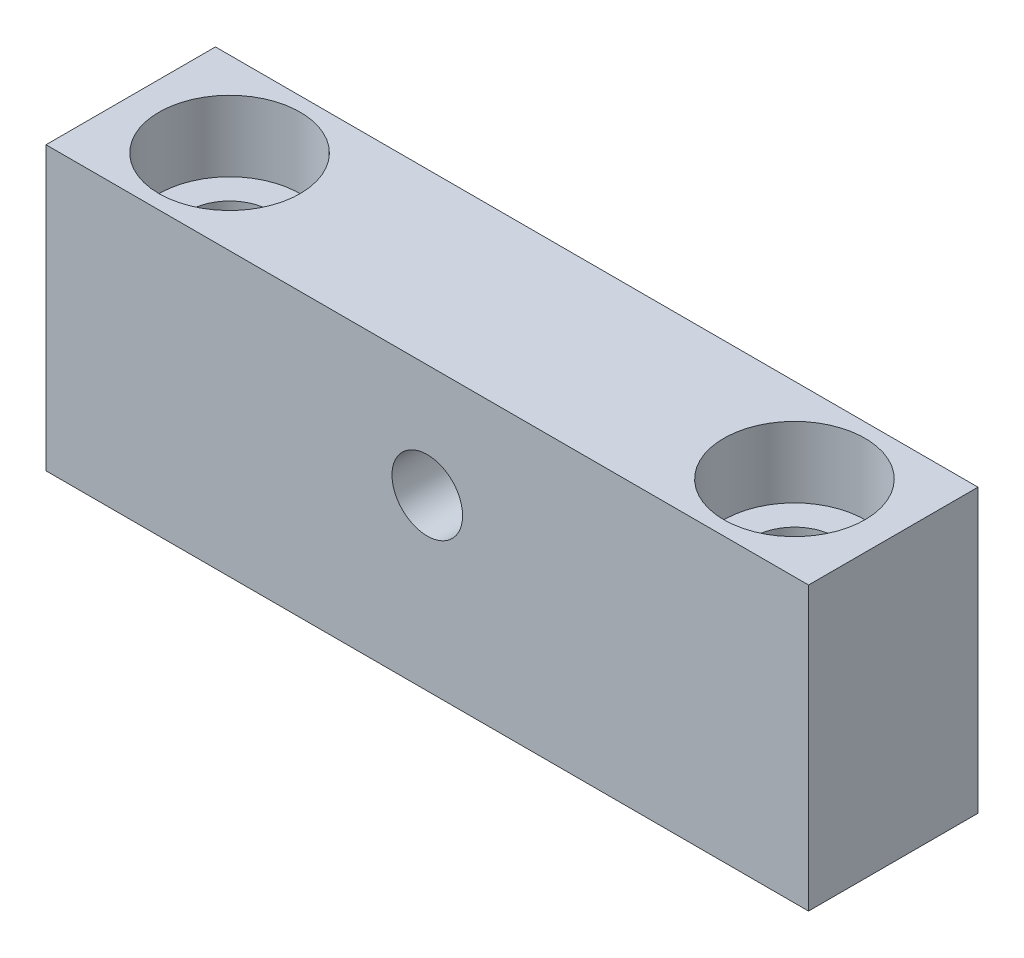
ISO-10303-21;
HEADER;
FILE_DESCRIPTION(('STEP AP214'),'2;1');
FILE_NAME('part.step','',(''),(''),'','','');
FILE_SCHEMA(('AUTOMOTIVE_DESIGN { 1 0 10303 214 1 1 1 1 }'));
ENDSEC;
DATA;
#1=APPLICATION_CONTEXT('core data for automotive mechanical design processes');
#2=APPLICATION_PROTOCOL_DEFINITION('international standard','automotive_design',2000,#1);
#3=PRODUCT_CONTEXT('',#1,'mechanical');
#4=PRODUCT('Part','Part','',(#3));
#5=PRODUCT_RELATED_PRODUCT_CATEGORY('part','',(#4));
#6=PRODUCT_DEFINITION_FORMATION('','',#4);
#7=PRODUCT_DEFINITION_CONTEXT('part definition',#1,'design');
#8=PRODUCT_DEFINITION('design','',#6,#7);
#9=PRODUCT_DEFINITION_SHAPE('','',#8);
#10=(LENGTH_UNIT() NAMED_UNIT(*) SI_UNIT(.MILLI.,.METRE.));
#11=(NAMED_UNIT(*) PLANE_ANGLE_UNIT() SI_UNIT($,.RADIAN.));
#12=(NAMED_UNIT(*) SI_UNIT($,.STERADIAN.) SOLID_ANGLE_UNIT());
#13=UNCERTAINTY_MEASURE_WITH_UNIT(LENGTH_MEASURE(1.E-05),#10,'distance_accuracy_value','');
#14=(GEOMETRIC_REPRESENTATION_CONTEXT(3) GLOBAL_UNCERTAINTY_ASSIGNED_CONTEXT((#13)) GLOBAL_UNIT_ASSIGNED_CONTEXT((#10,
#11,#12)) REPRESENTATION_CONTEXT('',''));
#15=CARTESIAN_POINT('',(0.,0.,0.));
#16=DIRECTION('',(0.,0.,1.));
#17=DIRECTION('',(1.,0.,0.));
#18=AXIS2_PLACEMENT_3D('',#15,#16,#17);
#19=CARTESIAN_POINT('',(0.,0.,12.));
#20=DIRECTION('',(1.,0.,0.));
#21=DIRECTION('',(0.,0.,-1.));
#22=AXIS2_PLACEMENT_3D('',#19,#20,#21);
#23=PLANE('',#22);
#24=DIRECTION('',(0.,-1.,0.));
#25=VECTOR('',#24,1.);
#26=CARTESIAN_POINT('',(0.,0.,0.));
#27=LINE('',#26,#25);
#28=CARTESIAN_POINT('',(0.,20.,0.));
#29=VERTEX_POINT('',#28);
#30=CARTESIAN_POINT('',(0.,0.,0.));
#31=VERTEX_POINT('',#30);
#32=EDGE_CURVE('E98',#29,#31,#27,.T.);
#33=ORIENTED_EDGE('',*,*,#32,.T.);
#34=DIRECTION('',(0.,0.,-1.));
#35=VECTOR('',#34,1.);
#36=CARTESIAN_POINT('',(0.,0.,12.));
#37=LINE('',#36,#35);
#38=CARTESIAN_POINT('',(0.,0.,12.));
#39=VERTEX_POINT('',#38);
#40=EDGE_CURVE('E11',#39,#31,#37,.T.);
#41=ORIENTED_EDGE('',*,*,#40,.F.);
#42=DIRECTION('',(0.,-1.,0.));
#43=VECTOR('',#42,1.);
#44=CARTESIAN_POINT('',(0.,0.,12.));
#45=LINE('',#44,#43);
#46=CARTESIAN_POINT('',(0.,20.,12.));
#47=VERTEX_POINT('',#46);
#48=EDGE_CURVE('E86',#47,#39,#45,.T.);
#49=ORIENTED_EDGE('',*,*,#48,.F.);
#50=DIRECTION('',(0.,0.,-1.));
#51=VECTOR('',#50,1.);
#52=CARTESIAN_POINT('',(0.,20.,12.));
#53=LINE('',#52,#51);
#54=EDGE_CURVE('E94',#47,#29,#53,.T.);
#55=ORIENTED_EDGE('',*,*,#54,.T.);
#56=EDGE_LOOP('',(#33,#41,#49,#55));
#57=FACE_BOUND('',#56,.T.);
#58=ADVANCED_FACE('F35',(#57),#23,.F.);
#59=CARTESIAN_POINT('',(0.,0.,12.));
#60=DIRECTION('',(0.,1.,0.));
#61=DIRECTION('',(0.,0.,1.));
#62=AXIS2_PLACEMENT_3D('',#59,#60,#61);
#63=PLANE('',#62);
#64=CARTESIAN_POINT('',(47.,0.,6.));
#65=DIRECTION('',(0.,1.,0.));
#66=DIRECTION('',(0.,0.,1.));
#67=AXIS2_PLACEMENT_3D('',#64,#65,#66);
#68=CIRCLE('',#67,2.89999999999999);
#69=CARTESIAN_POINT('',(47.,0.,8.89999999999999));
#70=VERTEX_POINT('',#69);
#71=EDGE_CURVE('E129',#70,#70,#68,.T.);
#72=ORIENTED_EDGE('',*,*,#71,.T.);
#73=EDGE_LOOP('',(#72));
#74=FACE_BOUND('',#73,.T.);
#75=CARTESIAN_POINT('',(7.,0.,6.));
#76=DIRECTION('',(0.,1.,0.));
#77=DIRECTION('',(0.,0.,1.));
#78=AXIS2_PLACEMENT_3D('',#75,#76,#77);
#79=CIRCLE('',#78,2.89999999999999);
#80=CARTESIAN_POINT('',(7.,0.,8.9));
#81=VERTEX_POINT('',#80);
#82=EDGE_CURVE('E117',#81,#81,#79,.T.);
#83=ORIENTED_EDGE('',*,*,#82,.T.);
#84=EDGE_LOOP('',(#83));
#85=FACE_BOUND('',#84,.T.);
#86=DIRECTION('',(1.,0.,0.));
#87=VECTOR('',#86,1.);
#88=CARTESIAN_POINT('',(0.,0.,0.));
#89=LINE('',#88,#87);
#90=CARTESIAN_POINT('',(54.,0.,0.));
#91=VERTEX_POINT('',#90);
#92=EDGE_CURVE('E90',#31,#91,#89,.T.);
#93=ORIENTED_EDGE('',*,*,#92,.T.);
#94=DIRECTION('',(0.,0.,-1.));
#95=VECTOR('',#94,1.);
#96=CARTESIAN_POINT('',(54.,0.,12.));
#97=LINE('',#96,#95);
#98=CARTESIAN_POINT('',(54.,0.,12.));
#99=VERTEX_POINT('',#98);
#100=EDGE_CURVE('E43',#99,#91,#97,.T.);
#101=ORIENTED_EDGE('',*,*,#100,.F.);
#102=DIRECTION('',(1.,0.,0.));
#103=VECTOR('',#102,1.);
#104=CARTESIAN_POINT('',(0.,0.,12.));
#105=LINE('',#104,#103);
#106=EDGE_CURVE('E81',#39,#99,#105,.T.);
#107=ORIENTED_EDGE('',*,*,#106,.F.);
#108=ORIENTED_EDGE('',*,*,#40,.T.);
#109=EDGE_LOOP('',(#93,#101,#107,#108));
#110=FACE_BOUND('',#109,.T.);
#111=ADVANCED_FACE('F89',(#74,#85,#110),#63,.F.);
#112=CARTESIAN_POINT('',(54.,0.,12.));
#113=DIRECTION('',(-1.,0.,0.));
#114=DIRECTION('',(0.,0.,1.));
#115=AXIS2_PLACEMENT_3D('',#112,#113,#114);
#116=PLANE('',#115);
#117=DIRECTION('',(0.,1.,0.));
#118=VECTOR('',#117,1.);
#119=CARTESIAN_POINT('',(54.,0.,0.));
#120=LINE('',#119,#118);
#121=CARTESIAN_POINT('',(54.,20.,0.));
#122=VERTEX_POINT('',#121);
#123=EDGE_CURVE('E68',#91,#122,#120,.T.);
#124=ORIENTED_EDGE('',*,*,#123,.T.);
#125=DIRECTION('',(0.,0.,-1.));
#126=VECTOR('',#125,1.);
#127=CARTESIAN_POINT('',(54.,20.,12.));
#128=LINE('',#127,#126);
#129=CARTESIAN_POINT('',(54.,20.,12.));
#130=VERTEX_POINT('',#129);
#131=EDGE_CURVE('E91',#130,#122,#128,.T.);
#132=ORIENTED_EDGE('',*,*,#131,.F.);
#133=DIRECTION('',(0.,1.,0.));
#134=VECTOR('',#133,1.);
#135=CARTESIAN_POINT('',(54.,0.,12.));
#136=LINE('',#135,#134);
#137=EDGE_CURVE('E84',#99,#130,#136,.T.);
#138=ORIENTED_EDGE('',*,*,#137,.F.);
#139=ORIENTED_EDGE('',*,*,#100,.T.);
#140=EDGE_LOOP('',(#124,#132,#138,#139));
#141=FACE_BOUND('',#140,.T.);
#142=ADVANCED_FACE('F92',(#141),#116,.F.);
#143=CARTESIAN_POINT('',(0.,20.,12.));
#144=DIRECTION('',(0.,-1.,0.));
#145=DIRECTION('',(0.,0.,-1.));
#146=AXIS2_PLACEMENT_3D('',#143,#144,#145);
#147=PLANE('',#146);
#148=CARTESIAN_POINT('',(47.,20.,6.));
#149=DIRECTION('',(0.,1.,0.));
#150=DIRECTION('',(0.,0.,1.));
#151=AXIS2_PLACEMENT_3D('',#148,#149,#150);
#152=CIRCLE('',#151,5.);
#153=CARTESIAN_POINT('',(47.,20.,11.));
#154=VERTEX_POINT('',#153);
#155=EDGE_CURVE('E138',#154,#154,#152,.T.);
#156=ORIENTED_EDGE('',*,*,#155,.F.);
#157=EDGE_LOOP('',(#156));
#158=FACE_BOUND('',#157,.T.);
#159=CARTESIAN_POINT('',(7.,20.,6.));
#160=DIRECTION('',(0.,1.,0.));
#161=DIRECTION('',(0.,0.,1.));
#162=AXIS2_PLACEMENT_3D('',#159,#160,#161);
#163=CIRCLE('',#162,5.);
#164=CARTESIAN_POINT('',(7.,20.,11.));
#165=VERTEX_POINT('',#164);
#166=EDGE_CURVE('E126',#165,#165,#163,.T.);
#167=ORIENTED_EDGE('',*,*,#166,.F.);
#168=EDGE_LOOP('',(#167));
#169=FACE_BOUND('',#168,.T.);
#170=DIRECTION('',(-1.,0.,0.));
#171=VECTOR('',#170,1.);
#172=CARTESIAN_POINT('',(0.,20.,0.));
#173=LINE('',#172,#171);
#174=EDGE_CURVE('E74',#122,#29,#173,.T.);
#175=ORIENTED_EDGE('',*,*,#174,.T.);
#176=ORIENTED_EDGE('',*,*,#54,.F.);
#177=DIRECTION('',(-1.,0.,0.));
#178=VECTOR('',#177,1.);
#179=CARTESIAN_POINT('',(0.,20.,12.));
#180=LINE('',#179,#178);
#181=EDGE_CURVE('E51',#130,#47,#180,.T.);
#182=ORIENTED_EDGE('',*,*,#181,.F.);
#183=ORIENTED_EDGE('',*,*,#131,.T.);
#184=EDGE_LOOP('',(#175,#176,#182,#183));
#185=FACE_BOUND('',#184,.T.);
#186=ADVANCED_FACE('F106',(#158,#169,#185),#147,.F.);
#187=CARTESIAN_POINT('',(0.,20.,12.));
#188=DIRECTION('',(0.,0.,-1.));
#189=DIRECTION('',(-1.,0.,0.));
#190=AXIS2_PLACEMENT_3D('',#187,#188,#189);
#191=PLANE('',#190);
#192=CARTESIAN_POINT('',(27.,12.,12.));
#193=DIRECTION('',(0.,0.,1.));
#194=DIRECTION('',(1.,0.,0.));
#195=AXIS2_PLACEMENT_3D('',#192,#193,#194);
#196=CIRCLE('',#195,2.49999999999999);
#197=CARTESIAN_POINT('',(29.5,12.,12.));
#198=VERTEX_POINT('',#197);
#199=EDGE_CURVE('E114',#198,#198,#196,.T.);
#200=ORIENTED_EDGE('',*,*,#199,.F.);
#201=EDGE_LOOP('',(#200));
#202=FACE_BOUND('',#201,.T.);
#203=ORIENTED_EDGE('',*,*,#48,.T.);
#204=ORIENTED_EDGE('',*,*,#106,.T.);
#205=ORIENTED_EDGE('',*,*,#137,.T.);
#206=ORIENTED_EDGE('',*,*,#181,.T.);
#207=EDGE_LOOP('',(#203,#204,#205,#206));
#208=FACE_BOUND('',#207,.T.);
#209=ADVANCED_FACE('F82',(#202,#208),#191,.F.);
#210=CARTESIAN_POINT('',(0.,20.,0.));
#211=DIRECTION('',(0.,0.,-1.));
#212=DIRECTION('',(-1.,0.,0.));
#213=AXIS2_PLACEMENT_3D('',#210,#211,#212);
#214=PLANE('',#213);
#215=CARTESIAN_POINT('',(27.,12.,0.));
#216=DIRECTION('',(0.,0.,1.));
#217=DIRECTION('',(1.,0.,0.));
#218=AXIS2_PLACEMENT_3D('',#215,#216,#217);
#219=CIRCLE('',#218,2.5);
#220=CARTESIAN_POINT('',(29.5,12.,0.));
#221=VERTEX_POINT('',#220);
#222=EDGE_CURVE('E101',#221,#221,#219,.T.);
#223=ORIENTED_EDGE('',*,*,#222,.T.);
#224=EDGE_LOOP('',(#223));
#225=FACE_BOUND('',#224,.T.);
#226=ORIENTED_EDGE('',*,*,#32,.F.);
#227=ORIENTED_EDGE('',*,*,#174,.F.);
#228=ORIENTED_EDGE('',*,*,#123,.F.);
#229=ORIENTED_EDGE('',*,*,#92,.F.);
#230=EDGE_LOOP('',(#226,#227,#228,#229));
#231=FACE_BOUND('',#230,.T.);
#232=ADVANCED_FACE('F109',(#225,#231),#214,.T.);
#233=CARTESIAN_POINT('',(27.,12.,12.));
#234=DIRECTION('',(0.,0.,1.));
#235=DIRECTION('',(1.,0.,0.));
#236=AXIS2_PLACEMENT_3D('',#233,#234,#235);
#237=CYLINDRICAL_SURFACE('',#236,2.49999999999999);
#238=ORIENTED_EDGE('',*,*,#222,.F.);
#239=EDGE_LOOP('',(#238));
#240=FACE_BOUND('',#239,.T.);
#241=ORIENTED_EDGE('',*,*,#199,.T.);
#242=EDGE_LOOP('',(#241));
#243=FACE_BOUND('',#242,.T.);
#244=ADVANCED_FACE('F180',(#240,#243),#237,.F.);
#245=CARTESIAN_POINT('',(7.,20.,6.));
#246=DIRECTION('',(0.,1.,0.));
#247=DIRECTION('',(0.,0.,1.));
#248=AXIS2_PLACEMENT_3D('',#245,#246,#247);
#249=CYLINDRICAL_SURFACE('',#248,2.9);
#250=ORIENTED_EDGE('',*,*,#82,.F.);
#251=EDGE_LOOP('',(#250));
#252=FACE_BOUND('',#251,.T.);
#253=CARTESIAN_POINT('',(7.,15.,6.));
#254=DIRECTION('',(0.,1.,0.));
#255=DIRECTION('',(0.,0.,1.));
#256=AXIS2_PLACEMENT_3D('',#253,#254,#255);
#257=CIRCLE('',#256,2.9);
#258=CARTESIAN_POINT('',(7.,15.,8.9));
#259=VERTEX_POINT('',#258);
#260=EDGE_CURVE('E120',#259,#259,#257,.T.);
#261=ORIENTED_EDGE('',*,*,#260,.T.);
#262=EDGE_LOOP('',(#261));
#263=FACE_BOUND('',#262,.T.);
#264=ADVANCED_FACE('F162',(#252,#263),#249,.F.);
#265=CARTESIAN_POINT('',(9.9,15.,6.));
#266=DIRECTION('',(0.,-1.,0.));
#267=DIRECTION('',(0.,0.,-1.));
#268=AXIS2_PLACEMENT_3D('',#265,#266,#267);
#269=PLANE('',#268);
#270=ORIENTED_EDGE('',*,*,#260,.F.);
#271=EDGE_LOOP('',(#270));
#272=FACE_BOUND('',#271,.T.);
#273=CARTESIAN_POINT('',(7.,15.,6.));
#274=DIRECTION('',(0.,1.,0.));
#275=DIRECTION('',(0.,0.,1.));
#276=AXIS2_PLACEMENT_3D('',#273,#274,#275);
#277=CIRCLE('',#276,5.);
#278=CARTESIAN_POINT('',(7.,15.,11.));
#279=VERTEX_POINT('',#278);
#280=EDGE_CURVE('E123',#279,#279,#277,.T.);
#281=ORIENTED_EDGE('',*,*,#280,.T.);
#282=EDGE_LOOP('',(#281));
#283=FACE_BOUND('',#282,.T.);
#284=ADVANCED_FACE('F152',(#272,#283),#269,.F.);
#285=CARTESIAN_POINT('',(7.,20.,6.));
#286=DIRECTION('',(0.,1.,0.));
#287=DIRECTION('',(0.,0.,1.));
#288=AXIS2_PLACEMENT_3D('',#285,#286,#287);
#289=CYLINDRICAL_SURFACE('',#288,5.);
#290=ORIENTED_EDGE('',*,*,#280,.F.);
#291=EDGE_LOOP('',(#290));
#292=FACE_BOUND('',#291,.T.);
#293=ORIENTED_EDGE('',*,*,#166,.T.);
#294=EDGE_LOOP('',(#293));
#295=FACE_BOUND('',#294,.T.);
#296=ADVANCED_FACE('F149',(#292,#295),#289,.F.);
#297=CARTESIAN_POINT('',(47.,20.,6.));
#298=DIRECTION('',(0.,1.,0.));
#299=DIRECTION('',(0.,0.,1.));
#300=AXIS2_PLACEMENT_3D('',#297,#298,#299);
#301=CYLINDRICAL_SURFACE('',#300,2.9);
#302=ORIENTED_EDGE('',*,*,#71,.F.);
#303=EDGE_LOOP('',(#302));
#304=FACE_BOUND('',#303,.T.);
#305=CARTESIAN_POINT('',(47.,15.,6.));
#306=DIRECTION('',(0.,1.,0.));
#307=DIRECTION('',(0.,0.,1.));
#308=AXIS2_PLACEMENT_3D('',#305,#306,#307);
#309=CIRCLE('',#308,2.9);
#310=CARTESIAN_POINT('',(47.,15.,8.9));
#311=VERTEX_POINT('',#310);
#312=EDGE_CURVE('E132',#311,#311,#309,.T.);
#313=ORIENTED_EDGE('',*,*,#312,.T.);
#314=EDGE_LOOP('',(#313));
#315=FACE_BOUND('',#314,.T.);
#316=ADVANCED_FACE('F151',(#304,#315),#301,.F.);
#317=CARTESIAN_POINT('',(49.9,15.,6.));
#318=DIRECTION('',(0.,-1.,0.));
#319=DIRECTION('',(0.,0.,-1.));
#320=AXIS2_PLACEMENT_3D('',#317,#318,#319);
#321=PLANE('',#320);
#322=ORIENTED_EDGE('',*,*,#312,.F.);
#323=EDGE_LOOP('',(#322));
#324=FACE_BOUND('',#323,.T.);
#325=CARTESIAN_POINT('',(47.,15.,6.));
#326=DIRECTION('',(0.,1.,0.));
#327=DIRECTION('',(0.,0.,1.));
#328=AXIS2_PLACEMENT_3D('',#325,#326,#327);
#329=CIRCLE('',#328,5.);
#330=CARTESIAN_POINT('',(47.,15.,11.));
#331=VERTEX_POINT('',#330);
#332=EDGE_CURVE('E135',#331,#331,#329,.T.);
#333=ORIENTED_EDGE('',*,*,#332,.T.);
#334=EDGE_LOOP('',(#333));
#335=FACE_BOUND('',#334,.T.);
#336=ADVANCED_FACE('F159',(#324,#335),#321,.F.);
#337=CARTESIAN_POINT('',(47.,20.,6.));
#338=DIRECTION('',(0.,1.,0.));
#339=DIRECTION('',(0.,0.,1.));
#340=AXIS2_PLACEMENT_3D('',#337,#338,#339);
#341=CYLINDRICAL_SURFACE('',#340,5.);
#342=ORIENTED_EDGE('',*,*,#332,.F.);
#343=EDGE_LOOP('',(#342));
#344=FACE_BOUND('',#343,.T.);
#345=ORIENTED_EDGE('',*,*,#155,.T.);
#346=EDGE_LOOP('',(#345));
#347=FACE_BOUND('',#346,.T.);
#348=ADVANCED_FACE('F142',(#344,#347),#341,.F.);
#349=CLOSED_SHELL('',(#58,#111,#142,#186,#209,#232,#244,#264,#284,#296,#316,#336,#348));
#350=MANIFOLD_SOLID_BREP('B2',#349);
#351=ADVANCED_BREP_SHAPE_REPRESENTATION('',(#18,#350),#14);
#352=SHAPE_DEFINITION_REPRESENTATION(#9,#351);
ENDSEC;
END-ISO-10303-21;
